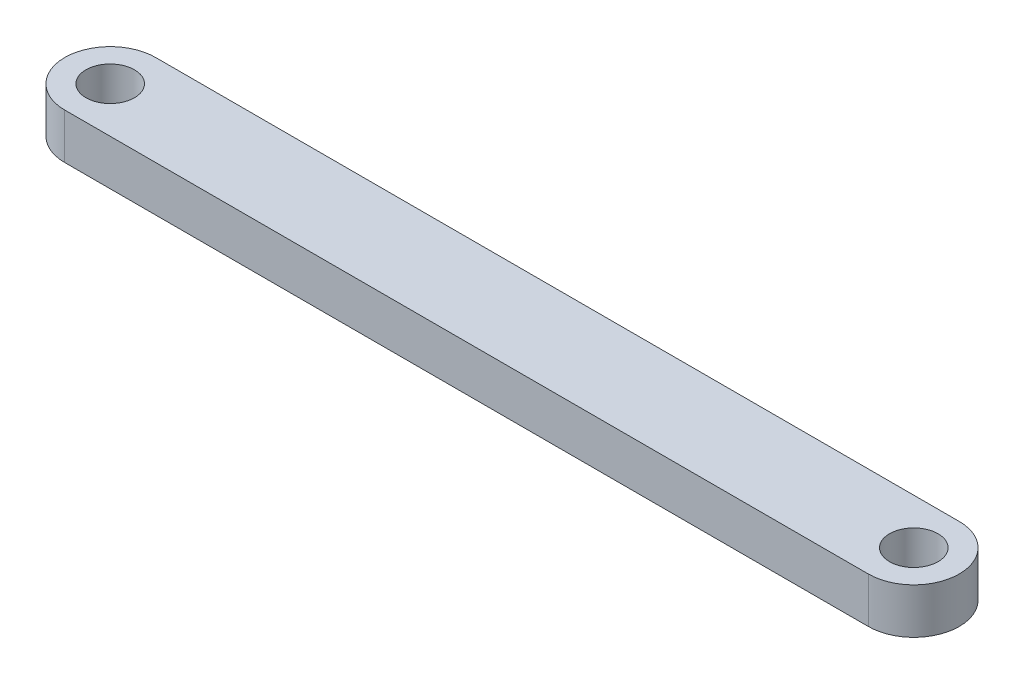
ISO-10303-21;
HEADER;
FILE_DESCRIPTION(('STEP AP214'),'2;1');
FILE_NAME('part.step','',(''),(''),'','','');
FILE_SCHEMA(('AUTOMOTIVE_DESIGN { 1 0 10303 214 1 1 1 1 }'));
ENDSEC;
DATA;
#1=APPLICATION_CONTEXT('core data for automotive mechanical design processes');
#2=APPLICATION_PROTOCOL_DEFINITION('international standard','automotive_design',2000,#1);
#3=PRODUCT_CONTEXT('',#1,'mechanical');
#4=PRODUCT('Part','Part','',(#3));
#5=PRODUCT_RELATED_PRODUCT_CATEGORY('part','',(#4));
#6=PRODUCT_DEFINITION_FORMATION('','',#4);
#7=PRODUCT_DEFINITION_CONTEXT('part definition',#1,'design');
#8=PRODUCT_DEFINITION('design','',#6,#7);
#9=PRODUCT_DEFINITION_SHAPE('','',#8);
#10=(LENGTH_UNIT() NAMED_UNIT(*) SI_UNIT(.MILLI.,.METRE.));
#11=(NAMED_UNIT(*) PLANE_ANGLE_UNIT() SI_UNIT($,.RADIAN.));
#12=(NAMED_UNIT(*) SI_UNIT($,.STERADIAN.) SOLID_ANGLE_UNIT());
#13=UNCERTAINTY_MEASURE_WITH_UNIT(LENGTH_MEASURE(1.E-05),#10,'distance_accuracy_value','');
#14=(GEOMETRIC_REPRESENTATION_CONTEXT(3) GLOBAL_UNCERTAINTY_ASSIGNED_CONTEXT((#13)) GLOBAL_UNIT_ASSIGNED_CONTEXT((#10,
#11,#12)) REPRESENTATION_CONTEXT('',''));
#15=CARTESIAN_POINT('',(0.,0.,0.));
#16=DIRECTION('',(0.,0.,1.));
#17=DIRECTION('',(1.,0.,0.));
#18=AXIS2_PLACEMENT_3D('',#15,#16,#17);
#19=CARTESIAN_POINT('',(0.,3.,0.));
#20=DIRECTION('',(0.,1.,0.));
#21=DIRECTION('',(0.,0.,1.));
#22=AXIS2_PLACEMENT_3D('',#19,#20,#21);
#23=PLANE('',#22);
#24=CARTESIAN_POINT('',(0.,3.,0.));
#25=DIRECTION('',(0.,1.,0.));
#26=DIRECTION('',(0.,0.,1.));
#27=AXIS2_PLACEMENT_3D('',#24,#25,#26);
#28=CIRCLE('',#27,1.6);
#29=CARTESIAN_POINT('',(0.,3.,1.6));
#30=VERTEX_POINT('',#29);
#31=EDGE_CURVE('E116',#30,#30,#28,.T.);
#32=ORIENTED_EDGE('',*,*,#31,.F.);
#33=EDGE_LOOP('',(#32));
#34=FACE_BOUND('',#33,.T.);
#35=CARTESIAN_POINT('',(0.,3.,0.));
#36=DIRECTION('',(0.,1.,0.));
#37=DIRECTION('',(0.,0.,1.));
#38=AXIS2_PLACEMENT_3D('',#35,#36,#37);
#39=CIRCLE('',#38,3.);
#40=CARTESIAN_POINT('',(0.,3.,-3.));
#41=VERTEX_POINT('',#40);
#42=CARTESIAN_POINT('',(0.,3.,3.));
#43=VERTEX_POINT('',#42);
#44=EDGE_CURVE('E96',#41,#43,#39,.T.);
#45=ORIENTED_EDGE('',*,*,#44,.T.);
#46=DIRECTION('',(1.,0.,0.));
#47=VECTOR('',#46,1.);
#48=CARTESIAN_POINT('',(0.,3.,3.));
#49=LINE('',#48,#47);
#50=CARTESIAN_POINT('',(53.,3.,3.));
#51=VERTEX_POINT('',#50);
#52=EDGE_CURVE('E91',#43,#51,#49,.T.);
#53=ORIENTED_EDGE('',*,*,#52,.T.);
#54=CARTESIAN_POINT('',(53.,3.,0.));
#55=DIRECTION('',(0.,1.,0.));
#56=DIRECTION('',(0.,0.,1.));
#57=AXIS2_PLACEMENT_3D('',#54,#55,#56);
#58=CIRCLE('',#57,3.);
#59=CARTESIAN_POINT('',(53.,3.,-3.));
#60=VERTEX_POINT('',#59);
#61=EDGE_CURVE('E94',#51,#60,#58,.T.);
#62=ORIENTED_EDGE('',*,*,#61,.T.);
#63=DIRECTION('',(-1.,0.,0.));
#64=VECTOR('',#63,1.);
#65=CARTESIAN_POINT('',(0.,3.,-3.));
#66=LINE('',#65,#64);
#67=EDGE_CURVE('E61',#60,#41,#66,.T.);
#68=ORIENTED_EDGE('',*,*,#67,.T.);
#69=EDGE_LOOP('',(#45,#53,#62,#68));
#70=FACE_BOUND('',#69,.T.);
#71=CARTESIAN_POINT('',(53.,3.,0.));
#72=DIRECTION('',(0.,1.,0.));
#73=DIRECTION('',(0.,0.,1.));
#74=AXIS2_PLACEMENT_3D('',#71,#72,#73);
#75=CIRCLE('',#74,1.6);
#76=CARTESIAN_POINT('',(53.,3.,1.6));
#77=VERTEX_POINT('',#76);
#78=EDGE_CURVE('E138',#77,#77,#75,.T.);
#79=ORIENTED_EDGE('',*,*,#78,.F.);
#80=EDGE_LOOP('',(#79));
#81=FACE_BOUND('',#80,.T.);
#82=ADVANCED_FACE('F43',(#34,#70,#81),#23,.T.);
#83=CARTESIAN_POINT('',(0.,0.,0.));
#84=DIRECTION('',(0.,1.,0.));
#85=DIRECTION('',(0.,0.,1.));
#86=AXIS2_PLACEMENT_3D('',#83,#84,#85);
#87=PLANE('',#86);
#88=CARTESIAN_POINT('',(0.,0.,0.));
#89=DIRECTION('',(0.,1.,0.));
#90=DIRECTION('',(0.,0.,1.));
#91=AXIS2_PLACEMENT_3D('',#88,#89,#90);
#92=CIRCLE('',#91,3.);
#93=CARTESIAN_POINT('',(0.,0.,-3.));
#94=VERTEX_POINT('',#93);
#95=CARTESIAN_POINT('',(0.,0.,3.));
#96=VERTEX_POINT('',#95);
#97=EDGE_CURVE('E112',#94,#96,#92,.T.);
#98=ORIENTED_EDGE('',*,*,#97,.F.);
#99=DIRECTION('',(-1.,0.,0.));
#100=VECTOR('',#99,1.);
#101=CARTESIAN_POINT('',(0.,0.,-3.));
#102=LINE('',#101,#100);
#103=CARTESIAN_POINT('',(53.,0.,-3.));
#104=VERTEX_POINT('',#103);
#105=EDGE_CURVE('E84',#104,#94,#102,.T.);
#106=ORIENTED_EDGE('',*,*,#105,.F.);
#107=CARTESIAN_POINT('',(53.,0.,0.));
#108=DIRECTION('',(0.,1.,0.));
#109=DIRECTION('',(0.,0.,1.));
#110=AXIS2_PLACEMENT_3D('',#107,#108,#109);
#111=CIRCLE('',#110,3.);
#112=CARTESIAN_POINT('',(53.,0.,3.));
#113=VERTEX_POINT('',#112);
#114=EDGE_CURVE('E78',#113,#104,#111,.T.);
#115=ORIENTED_EDGE('',*,*,#114,.F.);
#116=DIRECTION('',(1.,0.,0.));
#117=VECTOR('',#116,1.);
#118=CARTESIAN_POINT('',(0.,0.,3.));
#119=LINE('',#118,#117);
#120=EDGE_CURVE('E101',#96,#113,#119,.T.);
#121=ORIENTED_EDGE('',*,*,#120,.F.);
#122=EDGE_LOOP('',(#98,#106,#115,#121));
#123=FACE_BOUND('',#122,.T.);
#124=CARTESIAN_POINT('',(0.,0.,0.));
#125=DIRECTION('',(0.,1.,0.));
#126=DIRECTION('',(0.,0.,1.));
#127=AXIS2_PLACEMENT_3D('',#124,#125,#126);
#128=CIRCLE('',#127,1.6);
#129=CARTESIAN_POINT('',(0.,0.,1.6));
#130=VERTEX_POINT('',#129);
#131=EDGE_CURVE('E134',#130,#130,#128,.T.);
#132=ORIENTED_EDGE('',*,*,#131,.T.);
#133=EDGE_LOOP('',(#132));
#134=FACE_BOUND('',#133,.T.);
#135=CARTESIAN_POINT('',(53.,0.,0.));
#136=DIRECTION('',(0.,1.,0.));
#137=DIRECTION('',(0.,0.,1.));
#138=AXIS2_PLACEMENT_3D('',#135,#136,#137);
#139=CIRCLE('',#138,1.6);
#140=CARTESIAN_POINT('',(53.,0.,1.6));
#141=VERTEX_POINT('',#140);
#142=EDGE_CURVE('E142',#141,#141,#139,.T.);
#143=ORIENTED_EDGE('',*,*,#142,.T.);
#144=EDGE_LOOP('',(#143));
#145=FACE_BOUND('',#144,.T.);
#146=ADVANCED_FACE('F129',(#123,#134,#145),#87,.F.);
#147=CARTESIAN_POINT('',(0.,3.,0.));
#148=DIRECTION('',(0.,-1.,0.));
#149=DIRECTION('',(0.,0.,-1.));
#150=AXIS2_PLACEMENT_3D('',#147,#148,#149);
#151=CYLINDRICAL_SURFACE('',#150,3.);
#152=ORIENTED_EDGE('',*,*,#97,.T.);
#153=DIRECTION('',(0.,-1.,0.));
#154=VECTOR('',#153,1.);
#155=CARTESIAN_POINT('',(0.,3.,3.));
#156=LINE('',#155,#154);
#157=EDGE_CURVE('E11',#43,#96,#156,.T.);
#158=ORIENTED_EDGE('',*,*,#157,.F.);
#159=ORIENTED_EDGE('',*,*,#44,.F.);
#160=DIRECTION('',(0.,-1.,0.));
#161=VECTOR('',#160,1.);
#162=CARTESIAN_POINT('',(0.,3.,-3.));
#163=LINE('',#162,#161);
#164=EDGE_CURVE('E108',#41,#94,#163,.T.);
#165=ORIENTED_EDGE('',*,*,#164,.T.);
#166=EDGE_LOOP('',(#152,#158,#159,#165));
#167=FACE_BOUND('',#166,.T.);
#168=ADVANCED_FACE('F45',(#167),#151,.T.);
#169=CARTESIAN_POINT('',(0.,3.,3.));
#170=DIRECTION('',(0.,0.,-1.));
#171=DIRECTION('',(-1.,0.,0.));
#172=AXIS2_PLACEMENT_3D('',#169,#170,#171);
#173=PLANE('',#172);
#174=ORIENTED_EDGE('',*,*,#120,.T.);
#175=DIRECTION('',(0.,-1.,0.));
#176=VECTOR('',#175,1.);
#177=CARTESIAN_POINT('',(53.,3.,3.));
#178=LINE('',#177,#176);
#179=EDGE_CURVE('E53',#51,#113,#178,.T.);
#180=ORIENTED_EDGE('',*,*,#179,.F.);
#181=ORIENTED_EDGE('',*,*,#52,.F.);
#182=ORIENTED_EDGE('',*,*,#157,.T.);
#183=EDGE_LOOP('',(#174,#180,#181,#182));
#184=FACE_BOUND('',#183,.T.);
#185=ADVANCED_FACE('F100',(#184),#173,.F.);
#186=CARTESIAN_POINT('',(53.,3.,0.));
#187=DIRECTION('',(0.,-1.,0.));
#188=DIRECTION('',(0.,0.,-1.));
#189=AXIS2_PLACEMENT_3D('',#186,#187,#188);
#190=CYLINDRICAL_SURFACE('',#189,3.);
#191=ORIENTED_EDGE('',*,*,#114,.T.);
#192=DIRECTION('',(0.,-1.,0.));
#193=VECTOR('',#192,1.);
#194=CARTESIAN_POINT('',(53.,3.,-3.));
#195=LINE('',#194,#193);
#196=EDGE_CURVE('E103',#60,#104,#195,.T.);
#197=ORIENTED_EDGE('',*,*,#196,.F.);
#198=ORIENTED_EDGE('',*,*,#61,.F.);
#199=ORIENTED_EDGE('',*,*,#179,.T.);
#200=EDGE_LOOP('',(#191,#197,#198,#199));
#201=FACE_BOUND('',#200,.T.);
#202=ADVANCED_FACE('F104',(#201),#190,.T.);
#203=CARTESIAN_POINT('',(0.,3.,-3.));
#204=DIRECTION('',(0.,0.,1.));
#205=DIRECTION('',(1.,0.,0.));
#206=AXIS2_PLACEMENT_3D('',#203,#204,#205);
#207=PLANE('',#206);
#208=ORIENTED_EDGE('',*,*,#105,.T.);
#209=ORIENTED_EDGE('',*,*,#164,.F.);
#210=ORIENTED_EDGE('',*,*,#67,.F.);
#211=ORIENTED_EDGE('',*,*,#196,.T.);
#212=EDGE_LOOP('',(#208,#209,#210,#211));
#213=FACE_BOUND('',#212,.T.);
#214=ADVANCED_FACE('F126',(#213),#207,.F.);
#215=CARTESIAN_POINT('',(0.,3.,0.));
#216=DIRECTION('',(0.,-1.,0.));
#217=DIRECTION('',(0.,0.,-1.));
#218=AXIS2_PLACEMENT_3D('',#215,#216,#217);
#219=CYLINDRICAL_SURFACE('',#218,1.6);
#220=ORIENTED_EDGE('',*,*,#31,.T.);
#221=EDGE_LOOP('',(#220));
#222=FACE_BOUND('',#221,.T.);
#223=ORIENTED_EDGE('',*,*,#131,.F.);
#224=EDGE_LOOP('',(#223));
#225=FACE_BOUND('',#224,.T.);
#226=ADVANCED_FACE('F161',(#222,#225),#219,.F.);
#227=CARTESIAN_POINT('',(53.,3.,0.));
#228=DIRECTION('',(0.,-1.,0.));
#229=DIRECTION('',(0.,0.,-1.));
#230=AXIS2_PLACEMENT_3D('',#227,#228,#229);
#231=CYLINDRICAL_SURFACE('',#230,1.6);
#232=ORIENTED_EDGE('',*,*,#78,.T.);
#233=EDGE_LOOP('',(#232));
#234=FACE_BOUND('',#233,.T.);
#235=ORIENTED_EDGE('',*,*,#142,.F.);
#236=EDGE_LOOP('',(#235));
#237=FACE_BOUND('',#236,.T.);
#238=ADVANCED_FACE('F150',(#234,#237),#231,.F.);
#239=CLOSED_SHELL('',(#82,#146,#168,#185,#202,#214,#226,#238));
#240=MANIFOLD_SOLID_BREP('B2',#239);
#241=ADVANCED_BREP_SHAPE_REPRESENTATION('',(#18,#240),#14);
#242=SHAPE_DEFINITION_REPRESENTATION(#9,#241);
ENDSEC;
END-ISO-10303-21;
